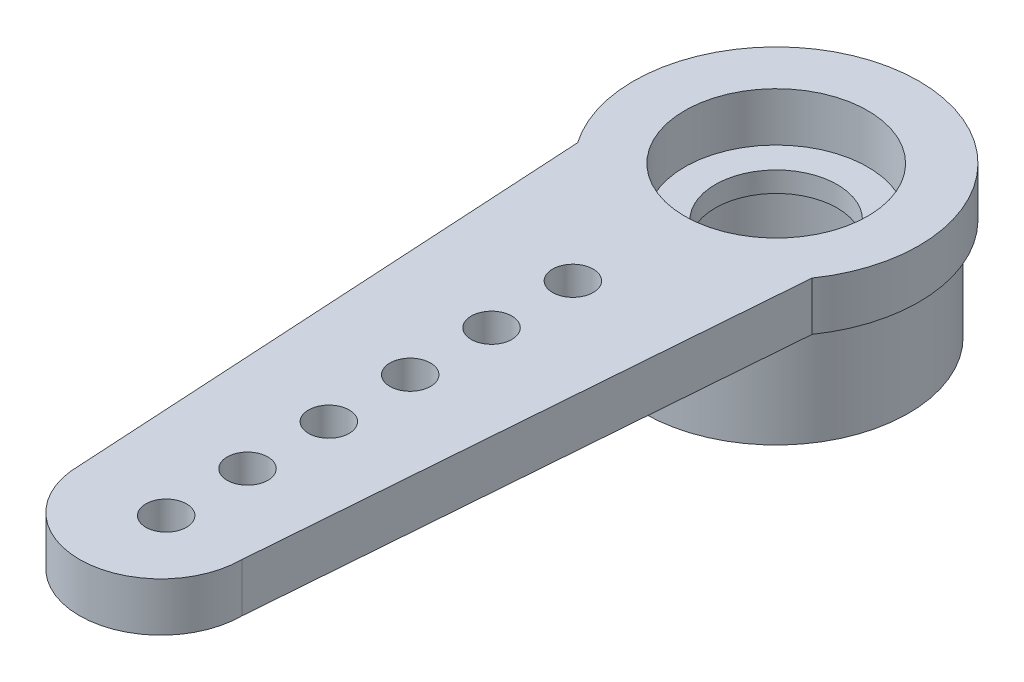
ISO-10303-21;
HEADER;
FILE_DESCRIPTION(('STEP AP214'),'2;1');
FILE_NAME('part.step','',(''),(''),'','','');
FILE_SCHEMA(('AUTOMOTIVE_DESIGN { 1 0 10303 214 1 1 1 1 }'));
ENDSEC;
DATA;
#1=APPLICATION_CONTEXT('core data for automotive mechanical design processes');
#2=APPLICATION_PROTOCOL_DEFINITION('international standard','automotive_design',2000,#1);
#3=PRODUCT_CONTEXT('',#1,'mechanical');
#4=PRODUCT('Part','Part','',(#3));
#5=PRODUCT_RELATED_PRODUCT_CATEGORY('part','',(#4));
#6=PRODUCT_DEFINITION_FORMATION('','',#4);
#7=PRODUCT_DEFINITION_CONTEXT('part definition',#1,'design');
#8=PRODUCT_DEFINITION('design','',#6,#7);
#9=PRODUCT_DEFINITION_SHAPE('','',#8);
#10=(LENGTH_UNIT() NAMED_UNIT(*) SI_UNIT(.MILLI.,.METRE.));
#11=(NAMED_UNIT(*) PLANE_ANGLE_UNIT() SI_UNIT($,.RADIAN.));
#12=(NAMED_UNIT(*) SI_UNIT($,.STERADIAN.) SOLID_ANGLE_UNIT());
#13=UNCERTAINTY_MEASURE_WITH_UNIT(LENGTH_MEASURE(1.E-05),#10,'distance_accuracy_value','');
#14=(GEOMETRIC_REPRESENTATION_CONTEXT(3) GLOBAL_UNCERTAINTY_ASSIGNED_CONTEXT((#13)) GLOBAL_UNIT_ASSIGNED_CONTEXT((#10,
#11,#12)) REPRESENTATION_CONTEXT('',''));
#15=CARTESIAN_POINT('',(0.,0.,0.));
#16=DIRECTION('',(0.,0.,1.));
#17=DIRECTION('',(1.,0.,0.));
#18=AXIS2_PLACEMENT_3D('',#15,#16,#17);
#19=CARTESIAN_POINT('',(0.,-2.5,0.));
#20=DIRECTION('',(0.,1.,0.));
#21=DIRECTION('',(0.,0.,1.));
#22=AXIS2_PLACEMENT_3D('',#19,#20,#21);
#23=CYLINDRICAL_SURFACE('',#22,1.5);
#24=CARTESIAN_POINT('',(0.,0.,0.));
#25=DIRECTION('',(0.,1.,0.));
#26=DIRECTION('',(0.,0.,1.));
#27=AXIS2_PLACEMENT_3D('',#24,#25,#26);
#28=CIRCLE('',#27,1.5);
#29=CARTESIAN_POINT('',(0.,0.,1.5));
#30=VERTEX_POINT('',#29);
#31=EDGE_CURVE('E191',#30,#30,#28,.T.);
#32=ORIENTED_EDGE('',*,*,#31,.T.);
#33=EDGE_LOOP('',(#32));
#34=FACE_BOUND('',#33,.T.);
#35=CARTESIAN_POINT('',(0.,-0.5,0.));
#36=DIRECTION('',(0.,-1.,0.));
#37=DIRECTION('',(0.,0.,-1.));
#38=AXIS2_PLACEMENT_3D('',#35,#36,#37);
#39=CIRCLE('',#38,1.5);
#40=CARTESIAN_POINT('',(0.,-0.5,-1.5));
#41=VERTEX_POINT('',#40);
#42=EDGE_CURVE('E43',#41,#41,#39,.F.);
#43=ORIENTED_EDGE('',*,*,#42,.F.);
#44=EDGE_LOOP('',(#43));
#45=FACE_BOUND('',#44,.T.);
#46=ADVANCED_FACE('F39',(#34,#45),#23,.F.);
#47=CARTESIAN_POINT('',(3.0200622306935,1.2,0.235729513906356));
#48=DIRECTION('',(0.996967594996785,0.,0.0778178291031487));
#49=DIRECTION('',(0.0778178291031487,0.,-0.996967594996785));
#50=AXIS2_PLACEMENT_3D('',#47,#48,#49);
#51=PLANE('',#50);
#52=DIRECTION('',(-0.0778178291031487,0.,0.996967594996785));
#53=VECTOR('',#52,1.);
#54=CARTESIAN_POINT('',(3.0200622306935,0.,0.235729513906356));
#55=LINE('',#54,#53);
#56=CARTESIAN_POINT('',(2.88235294117642,0.,2.));
#57=VERTEX_POINT('',#56);
#58=CARTESIAN_POINT('',(1.86764698383597,0.,14.999963756091));
#59=VERTEX_POINT('',#58);
#60=EDGE_CURVE('E139',#57,#59,#55,.T.);
#61=ORIENTED_EDGE('',*,*,#60,.F.);
#62=DIRECTION('',(0.,-1.,0.));
#63=VECTOR('',#62,1.);
#64=CARTESIAN_POINT('',(2.88235294117642,1.2,2.));
#65=LINE('',#64,#63);
#66=CARTESIAN_POINT('',(2.88235294117642,1.2,2.));
#67=VERTEX_POINT('',#66);
#68=EDGE_CURVE('E11',#67,#57,#65,.T.);
#69=ORIENTED_EDGE('',*,*,#68,.F.);
#70=DIRECTION('',(-0.0778178291031487,0.,0.996967594996785));
#71=VECTOR('',#70,1.);
#72=CARTESIAN_POINT('',(3.0200622306935,1.2,0.235729513906356));
#73=LINE('',#72,#71);
#74=CARTESIAN_POINT('',(1.86764698383597,1.2,14.999963756091));
#75=VERTEX_POINT('',#74);
#76=EDGE_CURVE('E91',#67,#75,#73,.T.);
#77=ORIENTED_EDGE('',*,*,#76,.T.);
#78=DIRECTION('',(0.,-1.,0.));
#79=VECTOR('',#78,1.);
#80=CARTESIAN_POINT('',(1.86764698383597,1.2,14.999963756091));
#81=LINE('',#80,#79);
#82=EDGE_CURVE('E58',#75,#59,#81,.T.);
#83=ORIENTED_EDGE('',*,*,#82,.T.);
#84=EDGE_LOOP('',(#61,#69,#77,#83));
#85=FACE_BOUND('',#84,.T.);
#86=ADVANCED_FACE('F41',(#85),#51,.T.);
#87=CARTESIAN_POINT('',(0.,1.2,0.));
#88=DIRECTION('',(0.,-1.,0.));
#89=DIRECTION('',(0.,0.,-1.));
#90=AXIS2_PLACEMENT_3D('',#87,#88,#89);
#91=CYLINDRICAL_SURFACE('',#90,3.50827001205842);
#92=CARTESIAN_POINT('',(0.,0.,0.));
#93=DIRECTION('',(0.,1.,0.));
#94=DIRECTION('',(0.,0.,1.));
#95=AXIS2_PLACEMENT_3D('',#92,#93,#94);
#96=CIRCLE('',#95,3.50827001205842);
#97=CARTESIAN_POINT('',(-2.88235294117642,0.,2.));
#98=VERTEX_POINT('',#97);
#99=EDGE_CURVE('E98',#57,#98,#96,.T.);
#100=ORIENTED_EDGE('',*,*,#99,.T.);
#101=DIRECTION('',(0.,-1.,0.));
#102=VECTOR('',#101,1.);
#103=CARTESIAN_POINT('',(-2.88235294117642,1.2,2.));
#104=LINE('',#103,#102);
#105=CARTESIAN_POINT('',(-2.88235294117642,1.2,2.));
#106=VERTEX_POINT('',#105);
#107=EDGE_CURVE('E50',#106,#98,#104,.T.);
#108=ORIENTED_EDGE('',*,*,#107,.F.);
#109=CARTESIAN_POINT('',(0.,1.2,0.));
#110=DIRECTION('',(0.,1.,0.));
#111=DIRECTION('',(0.,0.,1.));
#112=AXIS2_PLACEMENT_3D('',#109,#110,#111);
#113=CIRCLE('',#112,3.50827001205842);
#114=EDGE_CURVE('E84',#67,#106,#113,.T.);
#115=ORIENTED_EDGE('',*,*,#114,.F.);
#116=ORIENTED_EDGE('',*,*,#68,.T.);
#117=EDGE_LOOP('',(#100,#108,#115,#116));
#118=FACE_BOUND('',#117,.T.);
#119=ADVANCED_FACE('F96',(#118),#91,.T.);
#120=CARTESIAN_POINT('',(-2.98779725468056,1.2,0.17238066142057));
#121=DIRECTION('',(0.998339792905943,0.,-0.0575991137129555));
#122=DIRECTION('',(-0.0575991137129555,0.,-0.998339792905944));
#123=AXIS2_PLACEMENT_3D('',#120,#121,#122);
#124=PLANE('',#123);
#125=DIRECTION('',(0.0575991137129555,0.,0.998339792905944));
#126=VECTOR('',#125,1.);
#127=CARTESIAN_POINT('',(-2.98779725468056,0.,0.17238066142057));
#128=LINE('',#127,#126);
#129=CARTESIAN_POINT('',(-2.13235294117637,0.,14.9994160745409));
#130=VERTEX_POINT('',#129);
#131=EDGE_CURVE('E145',#98,#130,#128,.T.);
#132=ORIENTED_EDGE('',*,*,#131,.T.);
#133=DIRECTION('',(0.,-1.,0.));
#134=VECTOR('',#133,1.);
#135=CARTESIAN_POINT('',(-2.13235294117637,1.2,14.9994160745409));
#136=LINE('',#135,#134);
#137=CARTESIAN_POINT('',(-2.13235294117637,1.2,14.9994160745409));
#138=VERTEX_POINT('',#137);
#139=EDGE_CURVE('E72',#138,#130,#136,.T.);
#140=ORIENTED_EDGE('',*,*,#139,.F.);
#141=DIRECTION('',(0.0575991137129555,0.,0.998339792905944));
#142=VECTOR('',#141,1.);
#143=CARTESIAN_POINT('',(-2.98779725468056,1.2,0.17238066142057));
#144=LINE('',#143,#142);
#145=EDGE_CURVE('E90',#106,#138,#144,.T.);
#146=ORIENTED_EDGE('',*,*,#145,.F.);
#147=ORIENTED_EDGE('',*,*,#107,.T.);
#148=EDGE_LOOP('',(#132,#140,#146,#147));
#149=FACE_BOUND('',#148,.T.);
#150=ADVANCED_FACE('F103',(#149),#124,.F.);
#151=CARTESIAN_POINT('',(0.,1.2,5.));
#152=DIRECTION('',(0.,-1.,0.));
#153=DIRECTION('',(0.,0.,-1.));
#154=AXIS2_PLACEMENT_3D('',#151,#152,#153);
#155=CYLINDRICAL_SURFACE('',#154,0.5);
#156=CARTESIAN_POINT('',(0.,1.2,5.));
#157=DIRECTION('',(0.,1.,0.));
#158=DIRECTION('',(0.,0.,1.));
#159=AXIS2_PLACEMENT_3D('',#156,#157,#158);
#160=CIRCLE('',#159,0.5);
#161=CARTESIAN_POINT('',(0.,1.2,5.5));
#162=VERTEX_POINT('',#161);
#163=EDGE_CURVE('E131',#162,#162,#160,.F.);
#164=ORIENTED_EDGE('',*,*,#163,.F.);
#165=EDGE_LOOP('',(#164));
#166=FACE_BOUND('',#165,.T.);
#167=CARTESIAN_POINT('',(0.,0.,5.));
#168=DIRECTION('',(0.,1.,0.));
#169=DIRECTION('',(0.,0.,1.));
#170=AXIS2_PLACEMENT_3D('',#167,#168,#169);
#171=CIRCLE('',#170,0.5);
#172=CARTESIAN_POINT('',(0.,0.,5.5));
#173=VERTEX_POINT('',#172);
#174=EDGE_CURVE('E172',#173,#173,#171,.F.);
#175=ORIENTED_EDGE('',*,*,#174,.T.);
#176=EDGE_LOOP('',(#175));
#177=FACE_BOUND('',#176,.T.);
#178=ADVANCED_FACE('F246',(#166,#177),#155,.F.);
#179=CARTESIAN_POINT('',(0.,1.2,9.));
#180=DIRECTION('',(0.,-1.,0.));
#181=DIRECTION('',(0.,0.,-1.));
#182=AXIS2_PLACEMENT_3D('',#179,#180,#181);
#183=CYLINDRICAL_SURFACE('',#182,0.5);
#184=CARTESIAN_POINT('',(0.,1.2,9.));
#185=DIRECTION('',(0.,1.,0.));
#186=DIRECTION('',(0.,0.,1.));
#187=AXIS2_PLACEMENT_3D('',#184,#185,#186);
#188=CIRCLE('',#187,0.5);
#189=CARTESIAN_POINT('',(0.,1.2,9.5));
#190=VERTEX_POINT('',#189);
#191=EDGE_CURVE('E127',#190,#190,#188,.F.);
#192=ORIENTED_EDGE('',*,*,#191,.F.);
#193=EDGE_LOOP('',(#192));
#194=FACE_BOUND('',#193,.T.);
#195=CARTESIAN_POINT('',(0.,0.,9.));
#196=DIRECTION('',(0.,1.,0.));
#197=DIRECTION('',(0.,0.,1.));
#198=AXIS2_PLACEMENT_3D('',#195,#196,#197);
#199=CIRCLE('',#198,0.5);
#200=CARTESIAN_POINT('',(0.,0.,9.5));
#201=VERTEX_POINT('',#200);
#202=EDGE_CURVE('E168',#201,#201,#199,.F.);
#203=ORIENTED_EDGE('',*,*,#202,.T.);
#204=EDGE_LOOP('',(#203));
#205=FACE_BOUND('',#204,.T.);
#206=ADVANCED_FACE('F249',(#194,#205),#183,.F.);
#207=CARTESIAN_POINT('',(0.,1.2,13.));
#208=DIRECTION('',(0.,-1.,0.));
#209=DIRECTION('',(0.,0.,-1.));
#210=AXIS2_PLACEMENT_3D('',#207,#208,#209);
#211=CYLINDRICAL_SURFACE('',#210,0.5);
#212=CARTESIAN_POINT('',(0.,1.2,13.));
#213=DIRECTION('',(0.,1.,0.));
#214=DIRECTION('',(0.,0.,1.));
#215=AXIS2_PLACEMENT_3D('',#212,#213,#214);
#216=CIRCLE('',#215,0.5);
#217=CARTESIAN_POINT('',(0.,1.2,13.5));
#218=VERTEX_POINT('',#217);
#219=EDGE_CURVE('E123',#218,#218,#216,.F.);
#220=ORIENTED_EDGE('',*,*,#219,.F.);
#221=EDGE_LOOP('',(#220));
#222=FACE_BOUND('',#221,.T.);
#223=CARTESIAN_POINT('',(0.,0.,13.));
#224=DIRECTION('',(0.,1.,0.));
#225=DIRECTION('',(0.,0.,1.));
#226=AXIS2_PLACEMENT_3D('',#223,#224,#225);
#227=CIRCLE('',#226,0.5);
#228=CARTESIAN_POINT('',(0.,0.,13.5));
#229=VERTEX_POINT('',#228);
#230=EDGE_CURVE('E164',#229,#229,#227,.F.);
#231=ORIENTED_EDGE('',*,*,#230,.T.);
#232=EDGE_LOOP('',(#231));
#233=FACE_BOUND('',#232,.T.);
#234=ADVANCED_FACE('F253',(#222,#233),#211,.F.);
#235=CARTESIAN_POINT('',(0.,1.2,15.));
#236=DIRECTION('',(0.,-1.,0.));
#237=DIRECTION('',(0.,0.,-1.));
#238=AXIS2_PLACEMENT_3D('',#235,#236,#237);
#239=CYLINDRICAL_SURFACE('',#238,0.5);
#240=CARTESIAN_POINT('',(0.,1.2,15.));
#241=DIRECTION('',(0.,1.,0.));
#242=DIRECTION('',(0.,0.,1.));
#243=AXIS2_PLACEMENT_3D('',#240,#241,#242);
#244=CIRCLE('',#243,0.5);
#245=CARTESIAN_POINT('',(0.,1.2,15.5));
#246=VERTEX_POINT('',#245);
#247=EDGE_CURVE('E119',#246,#246,#244,.F.);
#248=ORIENTED_EDGE('',*,*,#247,.F.);
#249=EDGE_LOOP('',(#248));
#250=FACE_BOUND('',#249,.T.);
#251=CARTESIAN_POINT('',(0.,0.,15.));
#252=DIRECTION('',(0.,1.,0.));
#253=DIRECTION('',(0.,0.,1.));
#254=AXIS2_PLACEMENT_3D('',#251,#252,#253);
#255=CIRCLE('',#254,0.5);
#256=CARTESIAN_POINT('',(0.,0.,15.5));
#257=VERTEX_POINT('',#256);
#258=EDGE_CURVE('E160',#257,#257,#255,.F.);
#259=ORIENTED_EDGE('',*,*,#258,.T.);
#260=EDGE_LOOP('',(#259));
#261=FACE_BOUND('',#260,.T.);
#262=ADVANCED_FACE('F257',(#250,#261),#239,.F.);
#263=CARTESIAN_POINT('',(0.,1.2,11.));
#264=DIRECTION('',(0.,-1.,0.));
#265=DIRECTION('',(0.,0.,-1.));
#266=AXIS2_PLACEMENT_3D('',#263,#264,#265);
#267=CYLINDRICAL_SURFACE('',#266,0.5);
#268=CARTESIAN_POINT('',(0.,1.2,11.));
#269=DIRECTION('',(0.,1.,0.));
#270=DIRECTION('',(0.,0.,1.));
#271=AXIS2_PLACEMENT_3D('',#268,#269,#270);
#272=CIRCLE('',#271,0.5);
#273=CARTESIAN_POINT('',(0.,1.2,11.5));
#274=VERTEX_POINT('',#273);
#275=EDGE_CURVE('E115',#274,#274,#272,.F.);
#276=ORIENTED_EDGE('',*,*,#275,.F.);
#277=EDGE_LOOP('',(#276));
#278=FACE_BOUND('',#277,.T.);
#279=CARTESIAN_POINT('',(0.,0.,11.));
#280=DIRECTION('',(0.,1.,0.));
#281=DIRECTION('',(0.,0.,1.));
#282=AXIS2_PLACEMENT_3D('',#279,#280,#281);
#283=CIRCLE('',#282,0.5);
#284=CARTESIAN_POINT('',(0.,0.,11.5));
#285=VERTEX_POINT('',#284);
#286=EDGE_CURVE('E156',#285,#285,#283,.F.);
#287=ORIENTED_EDGE('',*,*,#286,.T.);
#288=EDGE_LOOP('',(#287));
#289=FACE_BOUND('',#288,.T.);
#290=ADVANCED_FACE('F261',(#278,#289),#267,.F.);
#291=CARTESIAN_POINT('',(0.,1.2,7.));
#292=DIRECTION('',(0.,-1.,0.));
#293=DIRECTION('',(0.,0.,-1.));
#294=AXIS2_PLACEMENT_3D('',#291,#292,#293);
#295=CYLINDRICAL_SURFACE('',#294,0.5);
#296=CARTESIAN_POINT('',(0.,1.2,7.));
#297=DIRECTION('',(0.,1.,0.));
#298=DIRECTION('',(0.,0.,1.));
#299=AXIS2_PLACEMENT_3D('',#296,#297,#298);
#300=CIRCLE('',#299,0.5);
#301=CARTESIAN_POINT('',(0.,1.2,7.5));
#302=VERTEX_POINT('',#301);
#303=EDGE_CURVE('E108',#302,#302,#300,.F.);
#304=ORIENTED_EDGE('',*,*,#303,.F.);
#305=EDGE_LOOP('',(#304));
#306=FACE_BOUND('',#305,.T.);
#307=CARTESIAN_POINT('',(0.,0.,7.));
#308=DIRECTION('',(0.,1.,0.));
#309=DIRECTION('',(0.,0.,1.));
#310=AXIS2_PLACEMENT_3D('',#307,#308,#309);
#311=CIRCLE('',#310,0.5);
#312=CARTESIAN_POINT('',(0.,0.,7.5));
#313=VERTEX_POINT('',#312);
#314=EDGE_CURVE('E152',#313,#313,#311,.F.);
#315=ORIENTED_EDGE('',*,*,#314,.T.);
#316=EDGE_LOOP('',(#315));
#317=FACE_BOUND('',#316,.T.);
#318=ADVANCED_FACE('F265',(#306,#317),#295,.F.);
#319=CARTESIAN_POINT('',(-0.132352941176372,1.2,14.9994160785999));
#320=DIRECTION('',(0.,-1.,0.));
#321=DIRECTION('',(0.,0.,-1.));
#322=AXIS2_PLACEMENT_3D('',#319,#320,#321);
#323=CYLINDRICAL_SURFACE('',#322,2.);
#324=CARTESIAN_POINT('',(-0.132352941176372,0.,14.9994160785999));
#325=DIRECTION('',(0.,1.,0.));
#326=DIRECTION('',(0.,0.,1.));
#327=AXIS2_PLACEMENT_3D('',#324,#325,#326);
#328=CIRCLE('',#327,2.);
#329=EDGE_CURVE('E148',#59,#130,#328,.F.);
#330=ORIENTED_EDGE('',*,*,#329,.F.);
#331=ORIENTED_EDGE('',*,*,#82,.F.);
#332=CARTESIAN_POINT('',(-0.132352941176372,1.2,14.9994160785999));
#333=DIRECTION('',(0.,1.,0.));
#334=DIRECTION('',(0.,0.,1.));
#335=AXIS2_PLACEMENT_3D('',#332,#333,#334);
#336=CIRCLE('',#335,2.);
#337=EDGE_CURVE('E105',#75,#138,#336,.F.);
#338=ORIENTED_EDGE('',*,*,#337,.T.);
#339=ORIENTED_EDGE('',*,*,#139,.T.);
#340=EDGE_LOOP('',(#330,#331,#338,#339));
#341=FACE_BOUND('',#340,.T.);
#342=ADVANCED_FACE('F244',(#341),#323,.T.);
#343=CARTESIAN_POINT('',(0.,1.2,0.));
#344=DIRECTION('',(0.,-1.,0.));
#345=DIRECTION('',(0.,0.,-1.));
#346=AXIS2_PLACEMENT_3D('',#343,#344,#345);
#347=CYLINDRICAL_SURFACE('',#346,2.25);
#348=CARTESIAN_POINT('',(0.,1.2,0.));
#349=DIRECTION('',(0.,1.,0.));
#350=DIRECTION('',(0.,0.,1.));
#351=AXIS2_PLACEMENT_3D('',#348,#349,#350);
#352=CIRCLE('',#351,2.25);
#353=CARTESIAN_POINT('',(0.,1.2,2.25));
#354=VERTEX_POINT('',#353);
#355=EDGE_CURVE('E135',#354,#354,#352,.T.);
#356=ORIENTED_EDGE('',*,*,#355,.T.);
#357=EDGE_LOOP('',(#356));
#358=FACE_BOUND('',#357,.T.);
#359=CARTESIAN_POINT('',(0.,0.,0.));
#360=DIRECTION('',(0.,1.,0.));
#361=DIRECTION('',(0.,0.,1.));
#362=AXIS2_PLACEMENT_3D('',#359,#360,#361);
#363=CIRCLE('',#362,2.25);
#364=CARTESIAN_POINT('',(0.,0.,2.25));
#365=VERTEX_POINT('',#364);
#366=EDGE_CURVE('E176',#365,#365,#363,.T.);
#367=ORIENTED_EDGE('',*,*,#366,.F.);
#368=EDGE_LOOP('',(#367));
#369=FACE_BOUND('',#368,.T.);
#370=ADVANCED_FACE('F238',(#358,#369),#347,.F.);
#371=CARTESIAN_POINT('',(0.,1.2,0.));
#372=DIRECTION('',(0.,1.,0.));
#373=DIRECTION('',(0.,0.,1.));
#374=AXIS2_PLACEMENT_3D('',#371,#372,#373);
#375=PLANE('',#374);
#376=ORIENTED_EDGE('',*,*,#76,.F.);
#377=ORIENTED_EDGE('',*,*,#114,.T.);
#378=ORIENTED_EDGE('',*,*,#145,.T.);
#379=ORIENTED_EDGE('',*,*,#337,.F.);
#380=EDGE_LOOP('',(#376,#377,#378,#379));
#381=FACE_BOUND('',#380,.T.);
#382=ORIENTED_EDGE('',*,*,#303,.T.);
#383=EDGE_LOOP('',(#382));
#384=FACE_BOUND('',#383,.T.);
#385=ORIENTED_EDGE('',*,*,#275,.T.);
#386=EDGE_LOOP('',(#385));
#387=FACE_BOUND('',#386,.T.);
#388=ORIENTED_EDGE('',*,*,#247,.T.);
#389=EDGE_LOOP('',(#388));
#390=FACE_BOUND('',#389,.T.);
#391=ORIENTED_EDGE('',*,*,#219,.T.);
#392=EDGE_LOOP('',(#391));
#393=FACE_BOUND('',#392,.T.);
#394=ORIENTED_EDGE('',*,*,#191,.T.);
#395=EDGE_LOOP('',(#394));
#396=FACE_BOUND('',#395,.T.);
#397=ORIENTED_EDGE('',*,*,#163,.T.);
#398=EDGE_LOOP('',(#397));
#399=FACE_BOUND('',#398,.T.);
#400=ORIENTED_EDGE('',*,*,#355,.F.);
#401=EDGE_LOOP('',(#400));
#402=FACE_BOUND('',#401,.T.);
#403=ADVANCED_FACE('F86',(#381,#384,#387,#390,#393,#396,#399,#402),#375,.T.);
#404=CARTESIAN_POINT('',(0.,0.,0.));
#405=DIRECTION('',(0.,1.,0.));
#406=DIRECTION('',(0.,0.,1.));
#407=AXIS2_PLACEMENT_3D('',#404,#405,#406);
#408=PLANE('',#407);
#409=CARTESIAN_POINT('',(0.,0.,0.));
#410=DIRECTION('',(0.,1.,0.));
#411=DIRECTION('',(0.,0.,1.));
#412=AXIS2_PLACEMENT_3D('',#409,#410,#411);
#413=CIRCLE('',#412,3.25);
#414=CARTESIAN_POINT('',(0.,0.,3.25));
#415=VERTEX_POINT('',#414);
#416=EDGE_CURVE('E187',#415,#415,#413,.T.);
#417=ORIENTED_EDGE('',*,*,#416,.T.);
#418=EDGE_LOOP('',(#417));
#419=FACE_BOUND('',#418,.T.);
#420=ORIENTED_EDGE('',*,*,#60,.T.);
#421=ORIENTED_EDGE('',*,*,#329,.T.);
#422=ORIENTED_EDGE('',*,*,#131,.F.);
#423=ORIENTED_EDGE('',*,*,#99,.F.);
#424=EDGE_LOOP('',(#420,#421,#422,#423));
#425=FACE_BOUND('',#424,.T.);
#426=ORIENTED_EDGE('',*,*,#314,.F.);
#427=EDGE_LOOP('',(#426));
#428=FACE_BOUND('',#427,.T.);
#429=ORIENTED_EDGE('',*,*,#286,.F.);
#430=EDGE_LOOP('',(#429));
#431=FACE_BOUND('',#430,.T.);
#432=ORIENTED_EDGE('',*,*,#258,.F.);
#433=EDGE_LOOP('',(#432));
#434=FACE_BOUND('',#433,.T.);
#435=ORIENTED_EDGE('',*,*,#230,.F.);
#436=EDGE_LOOP('',(#435));
#437=FACE_BOUND('',#436,.T.);
#438=ORIENTED_EDGE('',*,*,#202,.F.);
#439=EDGE_LOOP('',(#438));
#440=FACE_BOUND('',#439,.T.);
#441=ORIENTED_EDGE('',*,*,#174,.F.);
#442=EDGE_LOOP('',(#441));
#443=FACE_BOUND('',#442,.T.);
#444=ADVANCED_FACE('F231',(#419,#425,#428,#431,#434,#437,#440,#443),#408,.F.);
#445=CARTESIAN_POINT('',(0.,0.,0.));
#446=DIRECTION('',(0.,1.,0.));
#447=DIRECTION('',(0.,0.,1.));
#448=AXIS2_PLACEMENT_3D('',#445,#446,#447);
#449=PLANE('',#448);
#450=ORIENTED_EDGE('',*,*,#31,.F.);
#451=EDGE_LOOP('',(#450));
#452=FACE_BOUND('',#451,.T.);
#453=ORIENTED_EDGE('',*,*,#366,.T.);
#454=EDGE_LOOP('',(#453));
#455=FACE_BOUND('',#454,.T.);
#456=ADVANCED_FACE('F228',(#452,#455),#449,.T.);
#457=CARTESIAN_POINT('',(0.,-2.5,0.));
#458=DIRECTION('',(0.,1.,0.));
#459=DIRECTION('',(0.,0.,1.));
#460=AXIS2_PLACEMENT_3D('',#457,#458,#459);
#461=CYLINDRICAL_SURFACE('',#460,3.25);
#462=CARTESIAN_POINT('',(0.,-2.5,0.));
#463=DIRECTION('',(0.,1.,0.));
#464=DIRECTION('',(0.,0.,1.));
#465=AXIS2_PLACEMENT_3D('',#462,#463,#464);
#466=CIRCLE('',#465,3.25);
#467=CARTESIAN_POINT('',(0.,-2.5,3.25));
#468=VERTEX_POINT('',#467);
#469=EDGE_CURVE('E142',#468,#468,#466,.T.);
#470=ORIENTED_EDGE('',*,*,#469,.T.);
#471=EDGE_LOOP('',(#470));
#472=FACE_BOUND('',#471,.T.);
#473=ORIENTED_EDGE('',*,*,#416,.F.);
#474=EDGE_LOOP('',(#473));
#475=FACE_BOUND('',#474,.T.);
#476=ADVANCED_FACE('F226',(#472,#475),#461,.T.);
#477=CARTESIAN_POINT('',(0.,-2.5,0.));
#478=DIRECTION('',(0.,1.,0.));
#479=DIRECTION('',(0.,0.,1.));
#480=AXIS2_PLACEMENT_3D('',#477,#478,#479);
#481=PLANE('',#480);
#482=CARTESIAN_POINT('',(0.,-2.5,0.));
#483=DIRECTION('',(0.,-1.,0.));
#484=DIRECTION('',(0.,0.,-1.));
#485=AXIS2_PLACEMENT_3D('',#482,#483,#484);
#486=CIRCLE('',#485,2.5);
#487=CARTESIAN_POINT('',(0.,-2.5,-2.5));
#488=VERTEX_POINT('',#487);
#489=EDGE_CURVE('E198',#488,#488,#486,.T.);
#490=ORIENTED_EDGE('',*,*,#489,.F.);
#491=EDGE_LOOP('',(#490));
#492=FACE_BOUND('',#491,.T.);
#493=ORIENTED_EDGE('',*,*,#469,.F.);
#494=EDGE_LOOP('',(#493));
#495=FACE_BOUND('',#494,.T.);
#496=ADVANCED_FACE('F223',(#492,#495),#481,.F.);
#497=CARTESIAN_POINT('',(0.,-0.5,0.));
#498=DIRECTION('',(0.,-1.,0.));
#499=DIRECTION('',(0.,0.,-1.));
#500=AXIS2_PLACEMENT_3D('',#497,#498,#499);
#501=PLANE('',#500);
#502=CARTESIAN_POINT('',(0.,-0.5,0.));
#503=DIRECTION('',(0.,-1.,0.));
#504=DIRECTION('',(0.,0.,-1.));
#505=AXIS2_PLACEMENT_3D('',#502,#503,#504);
#506=CIRCLE('',#505,2.5);
#507=CARTESIAN_POINT('',(0.,-0.5,-2.5));
#508=VERTEX_POINT('',#507);
#509=EDGE_CURVE('E202',#508,#508,#506,.T.);
#510=ORIENTED_EDGE('',*,*,#509,.T.);
#511=EDGE_LOOP('',(#510));
#512=FACE_BOUND('',#511,.T.);
#513=ORIENTED_EDGE('',*,*,#42,.T.);
#514=EDGE_LOOP('',(#513));
#515=FACE_BOUND('',#514,.T.);
#516=ADVANCED_FACE('F211',(#512,#515),#501,.T.);
#517=CARTESIAN_POINT('',(0.,-0.5,0.));
#518=DIRECTION('',(0.,-1.,0.));
#519=DIRECTION('',(0.,0.,-1.));
#520=AXIS2_PLACEMENT_3D('',#517,#518,#519);
#521=CYLINDRICAL_SURFACE('',#520,2.5);
#522=ORIENTED_EDGE('',*,*,#509,.F.);
#523=EDGE_LOOP('',(#522));
#524=FACE_BOUND('',#523,.T.);
#525=ORIENTED_EDGE('',*,*,#489,.T.);
#526=EDGE_LOOP('',(#525));
#527=FACE_BOUND('',#526,.T.);
#528=ADVANCED_FACE('F221',(#524,#527),#521,.F.);
#529=CLOSED_SHELL('',(#46,#86,#119,#150,#178,#206,#234,#262,#290,#318,#342,#370,#403,#444,#456,
#476,#496,#516,#528));
#530=MANIFOLD_SOLID_BREP('B2',#529);
#531=ADVANCED_BREP_SHAPE_REPRESENTATION('',(#18,#530),#14);
#532=SHAPE_DEFINITION_REPRESENTATION(#9,#531);
ENDSEC;
END-ISO-10303-21;
